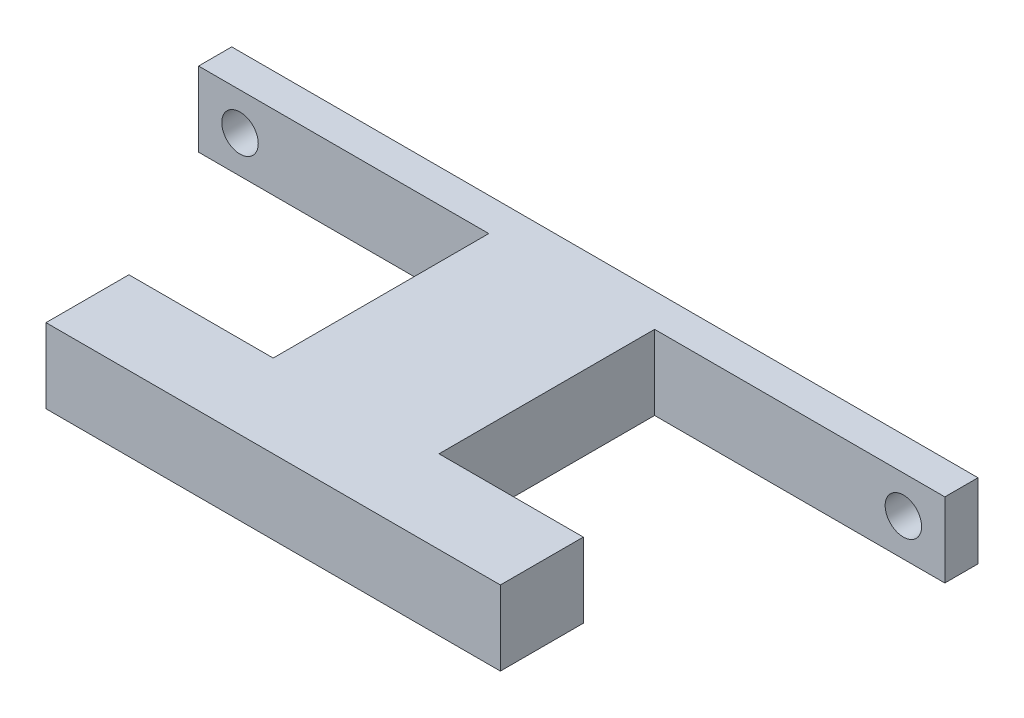
ISO-10303-21;
HEADER;
FILE_DESCRIPTION(('STEP AP214'),'2;1');
FILE_NAME('part.step','',(''),(''),'','','');
FILE_SCHEMA(('AUTOMOTIVE_DESIGN { 1 0 10303 214 1 1 1 1 }'));
ENDSEC;
DATA;
#1=APPLICATION_CONTEXT('core data for automotive mechanical design processes');
#2=APPLICATION_PROTOCOL_DEFINITION('international standard','automotive_design',2000,#1);
#3=PRODUCT_CONTEXT('',#1,'mechanical');
#4=PRODUCT('Part','Part','',(#3));
#5=PRODUCT_RELATED_PRODUCT_CATEGORY('part','',(#4));
#6=PRODUCT_DEFINITION_FORMATION('','',#4);
#7=PRODUCT_DEFINITION_CONTEXT('part definition',#1,'design');
#8=PRODUCT_DEFINITION('design','',#6,#7);
#9=PRODUCT_DEFINITION_SHAPE('','',#8);
#10=(LENGTH_UNIT() NAMED_UNIT(*) SI_UNIT(.MILLI.,.METRE.));
#11=(NAMED_UNIT(*) PLANE_ANGLE_UNIT() SI_UNIT($,.RADIAN.));
#12=(NAMED_UNIT(*) SI_UNIT($,.STERADIAN.) SOLID_ANGLE_UNIT());
#13=UNCERTAINTY_MEASURE_WITH_UNIT(LENGTH_MEASURE(1.E-05),#10,'distance_accuracy_value','');
#14=(GEOMETRIC_REPRESENTATION_CONTEXT(3) GLOBAL_UNCERTAINTY_ASSIGNED_CONTEXT((#13)) GLOBAL_UNIT_ASSIGNED_CONTEXT((#10,
#11,#12)) REPRESENTATION_CONTEXT('',''));
#15=CARTESIAN_POINT('',(0.,0.,0.));
#16=DIRECTION('',(0.,0.,1.));
#17=DIRECTION('',(1.,0.,0.));
#18=AXIS2_PLACEMENT_3D('',#15,#16,#17);
#19=CARTESIAN_POINT('',(-12.7,-5.71499999999998,50.8));
#20=DIRECTION('',(1.,0.,0.));
#21=DIRECTION('',(0.,0.,-1.));
#22=AXIS2_PLACEMENT_3D('',#19,#20,#21);
#23=PLANE('',#22);
#24=DIRECTION('',(0.,-1.,0.));
#25=VECTOR('',#24,1.);
#26=CARTESIAN_POINT('',(-12.7,0.,38.1));
#27=LINE('',#26,#25);
#28=CARTESIAN_POINT('',(-12.7,5.71499999999998,38.1));
#29=VERTEX_POINT('',#28);
#30=CARTESIAN_POINT('',(-12.7,-5.71499999999998,38.1));
#31=VERTEX_POINT('',#30);
#32=EDGE_CURVE('E134',#29,#31,#27,.T.);
#33=ORIENTED_EDGE('',*,*,#32,.F.);
#34=DIRECTION('',(0.,0.,-1.));
#35=VECTOR('',#34,1.);
#36=CARTESIAN_POINT('',(-12.7,5.71499999999998,50.8));
#37=LINE('',#36,#35);
#38=CARTESIAN_POINT('',(-12.7,5.71499999999998,5.08));
#39=VERTEX_POINT('',#38);
#40=EDGE_CURVE('E143',#29,#39,#37,.T.);
#41=ORIENTED_EDGE('',*,*,#40,.T.);
#42=DIRECTION('',(0.,-1.,0.));
#43=VECTOR('',#42,1.);
#44=CARTESIAN_POINT('',(-12.7,-5.71499999999998,5.08));
#45=LINE('',#44,#43);
#46=CARTESIAN_POINT('',(-12.7,-5.71499999999998,5.08));
#47=VERTEX_POINT('',#46);
#48=EDGE_CURVE('E218',#39,#47,#45,.T.);
#49=ORIENTED_EDGE('',*,*,#48,.T.);
#50=DIRECTION('',(0.,0.,-1.));
#51=VECTOR('',#50,1.);
#52=CARTESIAN_POINT('',(-12.7,-5.71499999999998,50.8));
#53=LINE('',#52,#51);
#54=EDGE_CURVE('E145',#31,#47,#53,.T.);
#55=ORIENTED_EDGE('',*,*,#54,.F.);
#56=EDGE_LOOP('',(#33,#41,#49,#55));
#57=FACE_BOUND('',#56,.T.);
#58=ADVANCED_FACE('F39',(#57),#23,.F.);
#59=CARTESIAN_POINT('',(12.7,-5.71499999999998,50.8));
#60=DIRECTION('',(-1.,0.,0.));
#61=DIRECTION('',(0.,0.,1.));
#62=AXIS2_PLACEMENT_3D('',#59,#60,#61);
#63=PLANE('',#62);
#64=DIRECTION('',(0.,1.,0.));
#65=VECTOR('',#64,1.);
#66=CARTESIAN_POINT('',(12.7,0.,38.1));
#67=LINE('',#66,#65);
#68=CARTESIAN_POINT('',(12.7,-5.71499999999998,38.1));
#69=VERTEX_POINT('',#68);
#70=CARTESIAN_POINT('',(12.7,5.71499999999998,38.1));
#71=VERTEX_POINT('',#70);
#72=EDGE_CURVE('E243',#69,#71,#67,.T.);
#73=ORIENTED_EDGE('',*,*,#72,.F.);
#74=DIRECTION('',(0.,0.,-1.));
#75=VECTOR('',#74,1.);
#76=CARTESIAN_POINT('',(12.7,-5.71499999999998,50.8));
#77=LINE('',#76,#75);
#78=CARTESIAN_POINT('',(12.7,-5.71499999999998,5.08));
#79=VERTEX_POINT('',#78);
#80=EDGE_CURVE('E54',#69,#79,#77,.T.);
#81=ORIENTED_EDGE('',*,*,#80,.T.);
#82=DIRECTION('',(0.,1.,0.));
#83=VECTOR('',#82,1.);
#84=CARTESIAN_POINT('',(12.7,-5.71499999999998,5.08));
#85=LINE('',#84,#83);
#86=CARTESIAN_POINT('',(12.7,5.71499999999998,5.08));
#87=VERTEX_POINT('',#86);
#88=EDGE_CURVE('E217',#79,#87,#85,.T.);
#89=ORIENTED_EDGE('',*,*,#88,.T.);
#90=DIRECTION('',(0.,0.,-1.));
#91=VECTOR('',#90,1.);
#92=CARTESIAN_POINT('',(12.7,5.71499999999998,50.8));
#93=LINE('',#92,#91);
#94=EDGE_CURVE('E62',#71,#87,#93,.T.);
#95=ORIENTED_EDGE('',*,*,#94,.F.);
#96=EDGE_LOOP('',(#73,#81,#89,#95));
#97=FACE_BOUND('',#96,.T.);
#98=ADVANCED_FACE('F277',(#97),#63,.F.);
#99=CARTESIAN_POINT('',(0.,0.,5.08));
#100=DIRECTION('',(0.,0.,1.));
#101=DIRECTION('',(1.,0.,0.));
#102=AXIS2_PLACEMENT_3D('',#99,#100,#101);
#103=PLANE('',#102);
#104=ORIENTED_EDGE('',*,*,#88,.F.);
#105=DIRECTION('',(-1.,0.,0.));
#106=VECTOR('',#105,1.);
#107=CARTESIAN_POINT('',(0.,-5.71499999999998,5.08));
#108=LINE('',#107,#106);
#109=CARTESIAN_POINT('',(57.15,-5.71499999999998,5.08));
#110=VERTEX_POINT('',#109);
#111=EDGE_CURVE('E164',#110,#79,#108,.T.);
#112=ORIENTED_EDGE('',*,*,#111,.F.);
#113=DIRECTION('',(0.,-1.,0.));
#114=VECTOR('',#113,1.);
#115=CARTESIAN_POINT('',(57.15,0.,5.08));
#116=LINE('',#115,#114);
#117=CARTESIAN_POINT('',(57.15,5.71499999999998,5.08));
#118=VERTEX_POINT('',#117);
#119=EDGE_CURVE('E167',#118,#110,#116,.T.);
#120=ORIENTED_EDGE('',*,*,#119,.F.);
#121=DIRECTION('',(1.,0.,0.));
#122=VECTOR('',#121,1.);
#123=CARTESIAN_POINT('',(0.,5.71499999999998,5.08));
#124=LINE('',#123,#122);
#125=EDGE_CURVE('E160',#87,#118,#124,.T.);
#126=ORIENTED_EDGE('',*,*,#125,.F.);
#127=EDGE_LOOP('',(#104,#112,#120,#126));
#128=FACE_BOUND('',#127,.T.);
#129=CARTESIAN_POINT('',(50.8,0.,5.08));
#130=DIRECTION('',(0.,0.,1.));
#131=DIRECTION('',(1.,0.,0.));
#132=AXIS2_PLACEMENT_3D('',#129,#130,#131);
#133=CIRCLE('',#132,2.794);
#134=CARTESIAN_POINT('',(53.594,0.,5.08));
#135=VERTEX_POINT('',#134);
#136=EDGE_CURVE('E173',#135,#135,#133,.T.);
#137=ORIENTED_EDGE('',*,*,#136,.F.);
#138=EDGE_LOOP('',(#137));
#139=FACE_BOUND('',#138,.T.);
#140=ADVANCED_FACE('F215',(#128,#139),#103,.T.);
#141=CARTESIAN_POINT('',(0.,5.71499999999998,5.08));
#142=DIRECTION('',(0.,1.,0.));
#143=DIRECTION('',(0.,0.,1.));
#144=AXIS2_PLACEMENT_3D('',#141,#142,#143);
#145=PLANE('',#144);
#146=DIRECTION('',(1.,0.,0.));
#147=VECTOR('',#146,1.);
#148=CARTESIAN_POINT('',(0.,5.71499999999998,0.));
#149=LINE('',#148,#147);
#150=CARTESIAN_POINT('',(-57.15,5.71499999999998,0.));
#151=VERTEX_POINT('',#150);
#152=CARTESIAN_POINT('',(57.15,5.71499999999998,0.));
#153=VERTEX_POINT('',#152);
#154=EDGE_CURVE('E153',#151,#153,#149,.T.);
#155=ORIENTED_EDGE('',*,*,#154,.F.);
#156=DIRECTION('',(0.,0.,-1.));
#157=VECTOR('',#156,1.);
#158=CARTESIAN_POINT('',(-57.15,5.71499999999998,5.08));
#159=LINE('',#158,#157);
#160=CARTESIAN_POINT('',(-57.15,5.71499999999998,5.08));
#161=VERTEX_POINT('',#160);
#162=EDGE_CURVE('E11',#161,#151,#159,.T.);
#163=ORIENTED_EDGE('',*,*,#162,.F.);
#164=EDGE_CURVE('E151',#161,#39,#124,.T.);
#165=ORIENTED_EDGE('',*,*,#164,.T.);
#166=ORIENTED_EDGE('',*,*,#40,.F.);
#167=DIRECTION('',(-1.,0.,0.));
#168=VECTOR('',#167,1.);
#169=CARTESIAN_POINT('',(0.,5.71499999999998,38.1));
#170=LINE('',#169,#168);
#171=CARTESIAN_POINT('',(-34.7966871988916,5.71499999999998,38.1));
#172=VERTEX_POINT('',#171);
#173=EDGE_CURVE('E131',#29,#172,#170,.T.);
#174=ORIENTED_EDGE('',*,*,#173,.T.);
#175=DIRECTION('',(0.,0.,1.));
#176=VECTOR('',#175,1.);
#177=CARTESIAN_POINT('',(-34.7966871988916,5.71499999999998,38.1));
#178=LINE('',#177,#176);
#179=CARTESIAN_POINT('',(-34.7966871988916,5.71499999999998,50.8));
#180=VERTEX_POINT('',#179);
#181=EDGE_CURVE('E248',#172,#180,#178,.T.);
#182=ORIENTED_EDGE('',*,*,#181,.T.);
#183=DIRECTION('',(-1.,0.,0.));
#184=VECTOR('',#183,1.);
#185=CARTESIAN_POINT('',(-12.7,5.71499999999998,50.8));
#186=LINE('',#185,#184);
#187=CARTESIAN_POINT('',(34.7966871988916,5.71499999999998,50.8));
#188=VERTEX_POINT('',#187);
#189=EDGE_CURVE('E221',#188,#180,#186,.T.);
#190=ORIENTED_EDGE('',*,*,#189,.F.);
#191=DIRECTION('',(0.,0.,1.));
#192=VECTOR('',#191,1.);
#193=CARTESIAN_POINT('',(34.7966871988916,5.71499999999998,38.1));
#194=LINE('',#193,#192);
#195=CARTESIAN_POINT('',(34.7966871988916,5.71499999999998,38.1));
#196=VERTEX_POINT('',#195);
#197=EDGE_CURVE('E224',#196,#188,#194,.T.);
#198=ORIENTED_EDGE('',*,*,#197,.F.);
#199=DIRECTION('',(1.,0.,0.));
#200=VECTOR('',#199,1.);
#201=CARTESIAN_POINT('',(0.,5.71499999999998,38.1));
#202=LINE('',#201,#200);
#203=EDGE_CURVE('E245',#71,#196,#202,.T.);
#204=ORIENTED_EDGE('',*,*,#203,.F.);
#205=ORIENTED_EDGE('',*,*,#94,.T.);
#206=ORIENTED_EDGE('',*,*,#125,.T.);
#207=DIRECTION('',(0.,0.,-1.));
#208=VECTOR('',#207,1.);
#209=CARTESIAN_POINT('',(57.15,5.71499999999998,5.08));
#210=LINE('',#209,#208);
#211=EDGE_CURVE('E176',#118,#153,#210,.T.);
#212=ORIENTED_EDGE('',*,*,#211,.T.);
#213=EDGE_LOOP('',(#155,#163,#165,#166,#174,#182,#190,#198,#204,#205,#206,#212));
#214=FACE_BOUND('',#213,.T.);
#215=ADVANCED_FACE('F41',(#214),#145,.T.);
#216=CARTESIAN_POINT('',(-57.15,0.,5.08));
#217=DIRECTION('',(-1.,0.,0.));
#218=DIRECTION('',(0.,0.,1.));
#219=AXIS2_PLACEMENT_3D('',#216,#217,#218);
#220=PLANE('',#219);
#221=DIRECTION('',(0.,1.,0.));
#222=VECTOR('',#221,1.);
#223=CARTESIAN_POINT('',(-57.15,0.,0.));
#224=LINE('',#223,#222);
#225=CARTESIAN_POINT('',(-57.15,-5.71499999999998,0.));
#226=VERTEX_POINT('',#225);
#227=EDGE_CURVE('E179',#226,#151,#224,.T.);
#228=ORIENTED_EDGE('',*,*,#227,.F.);
#229=DIRECTION('',(0.,0.,-1.));
#230=VECTOR('',#229,1.);
#231=CARTESIAN_POINT('',(-57.15,-5.71499999999998,5.08));
#232=LINE('',#231,#230);
#233=CARTESIAN_POINT('',(-57.15,-5.71499999999998,5.08));
#234=VERTEX_POINT('',#233);
#235=EDGE_CURVE('E47',#234,#226,#232,.T.);
#236=ORIENTED_EDGE('',*,*,#235,.F.);
#237=DIRECTION('',(0.,1.,0.));
#238=VECTOR('',#237,1.);
#239=CARTESIAN_POINT('',(-57.15,0.,5.08));
#240=LINE('',#239,#238);
#241=EDGE_CURVE('E159',#234,#161,#240,.T.);
#242=ORIENTED_EDGE('',*,*,#241,.T.);
#243=ORIENTED_EDGE('',*,*,#162,.T.);
#244=EDGE_LOOP('',(#228,#236,#242,#243));
#245=FACE_BOUND('',#244,.T.);
#246=ADVANCED_FACE('F204',(#245),#220,.T.);
#247=CARTESIAN_POINT('',(0.,-5.71499999999998,5.08));
#248=DIRECTION('',(0.,-1.,0.));
#249=DIRECTION('',(0.,0.,-1.));
#250=AXIS2_PLACEMENT_3D('',#247,#248,#249);
#251=PLANE('',#250);
#252=DIRECTION('',(-1.,0.,0.));
#253=VECTOR('',#252,1.);
#254=CARTESIAN_POINT('',(0.,-5.71499999999998,0.));
#255=LINE('',#254,#253);
#256=CARTESIAN_POINT('',(57.15,-5.71499999999998,0.));
#257=VERTEX_POINT('',#256);
#258=EDGE_CURVE('E182',#257,#226,#255,.T.);
#259=ORIENTED_EDGE('',*,*,#258,.F.);
#260=DIRECTION('',(0.,0.,-1.));
#261=VECTOR('',#260,1.);
#262=CARTESIAN_POINT('',(57.15,-5.71499999999998,5.08));
#263=LINE('',#262,#261);
#264=EDGE_CURVE('E195',#110,#257,#263,.T.);
#265=ORIENTED_EDGE('',*,*,#264,.F.);
#266=ORIENTED_EDGE('',*,*,#111,.T.);
#267=ORIENTED_EDGE('',*,*,#80,.F.);
#268=DIRECTION('',(1.,0.,0.));
#269=VECTOR('',#268,1.);
#270=CARTESIAN_POINT('',(0.,-5.71499999999998,38.1));
#271=LINE('',#270,#269);
#272=CARTESIAN_POINT('',(34.7966871988916,-5.71499999999998,38.1));
#273=VERTEX_POINT('',#272);
#274=EDGE_CURVE('E234',#69,#273,#271,.T.);
#275=ORIENTED_EDGE('',*,*,#274,.T.);
#276=DIRECTION('',(0.,0.,1.));
#277=VECTOR('',#276,1.);
#278=CARTESIAN_POINT('',(34.7966871988916,-5.71499999999998,38.1));
#279=LINE('',#278,#277);
#280=CARTESIAN_POINT('',(34.7966871988916,-5.71499999999998,50.8));
#281=VERTEX_POINT('',#280);
#282=EDGE_CURVE('E219',#273,#281,#279,.T.);
#283=ORIENTED_EDGE('',*,*,#282,.T.);
#284=DIRECTION('',(1.,0.,0.));
#285=VECTOR('',#284,1.);
#286=CARTESIAN_POINT('',(-12.7,-5.71499999999998,50.8));
#287=LINE('',#286,#285);
#288=CARTESIAN_POINT('',(-34.7966871988916,-5.71499999999998,50.8));
#289=VERTEX_POINT('',#288);
#290=EDGE_CURVE('E227',#289,#281,#287,.T.);
#291=ORIENTED_EDGE('',*,*,#290,.F.);
#292=DIRECTION('',(0.,0.,1.));
#293=VECTOR('',#292,1.);
#294=CARTESIAN_POINT('',(-34.7966871988916,-5.71499999999998,38.1));
#295=LINE('',#294,#293);
#296=CARTESIAN_POINT('',(-34.7966871988916,-5.71499999999998,38.1));
#297=VERTEX_POINT('',#296);
#298=EDGE_CURVE('E240',#297,#289,#295,.T.);
#299=ORIENTED_EDGE('',*,*,#298,.F.);
#300=DIRECTION('',(-1.,0.,0.));
#301=VECTOR('',#300,1.);
#302=CARTESIAN_POINT('',(0.,-5.71499999999998,38.1));
#303=LINE('',#302,#301);
#304=EDGE_CURVE('E250',#31,#297,#303,.T.);
#305=ORIENTED_EDGE('',*,*,#304,.F.);
#306=ORIENTED_EDGE('',*,*,#54,.T.);
#307=EDGE_CURVE('E163',#47,#234,#108,.T.);
#308=ORIENTED_EDGE('',*,*,#307,.T.);
#309=ORIENTED_EDGE('',*,*,#235,.T.);
#310=EDGE_LOOP('',(#259,#265,#266,#267,#275,#283,#291,#299,#305,#306,#308,#309));
#311=FACE_BOUND('',#310,.T.);
#312=ADVANCED_FACE('F200',(#311),#251,.T.);
#313=CARTESIAN_POINT('',(-50.8,0.,5.08));
#314=DIRECTION('',(0.,0.,-1.));
#315=DIRECTION('',(-1.,0.,0.));
#316=AXIS2_PLACEMENT_3D('',#313,#314,#315);
#317=CYLINDRICAL_SURFACE('',#316,2.794);
#318=CARTESIAN_POINT('',(-50.8,0.,5.08));
#319=DIRECTION('',(0.,0.,1.));
#320=DIRECTION('',(1.,0.,0.));
#321=AXIS2_PLACEMENT_3D('',#318,#319,#320);
#322=CIRCLE('',#321,2.794);
#323=CARTESIAN_POINT('',(-48.006,0.,5.08));
#324=VERTEX_POINT('',#323);
#325=EDGE_CURVE('E170',#324,#324,#322,.T.);
#326=ORIENTED_EDGE('',*,*,#325,.T.);
#327=EDGE_LOOP('',(#326));
#328=FACE_BOUND('',#327,.T.);
#329=CARTESIAN_POINT('',(-50.8,0.,0.));
#330=DIRECTION('',(0.,0.,1.));
#331=DIRECTION('',(1.,0.,0.));
#332=AXIS2_PLACEMENT_3D('',#329,#330,#331);
#333=CIRCLE('',#332,2.794);
#334=CARTESIAN_POINT('',(-48.006,0.,0.));
#335=VERTEX_POINT('',#334);
#336=EDGE_CURVE('E188',#335,#335,#333,.T.);
#337=ORIENTED_EDGE('',*,*,#336,.F.);
#338=EDGE_LOOP('',(#337));
#339=FACE_BOUND('',#338,.T.);
#340=ADVANCED_FACE('F290',(#328,#339),#317,.F.);
#341=CARTESIAN_POINT('',(57.15,0.,5.08));
#342=DIRECTION('',(1.,0.,0.));
#343=DIRECTION('',(0.,0.,-1.));
#344=AXIS2_PLACEMENT_3D('',#341,#342,#343);
#345=PLANE('',#344);
#346=DIRECTION('',(0.,-1.,0.));
#347=VECTOR('',#346,1.);
#348=CARTESIAN_POINT('',(57.15,0.,0.));
#349=LINE('',#348,#347);
#350=EDGE_CURVE('E185',#153,#257,#349,.T.);
#351=ORIENTED_EDGE('',*,*,#350,.F.);
#352=ORIENTED_EDGE('',*,*,#211,.F.);
#353=ORIENTED_EDGE('',*,*,#119,.T.);
#354=ORIENTED_EDGE('',*,*,#264,.T.);
#355=EDGE_LOOP('',(#351,#352,#353,#354));
#356=FACE_BOUND('',#355,.T.);
#357=ADVANCED_FACE('F211',(#356),#345,.T.);
#358=CARTESIAN_POINT('',(50.8,0.,5.08));
#359=DIRECTION('',(0.,0.,-1.));
#360=DIRECTION('',(-1.,0.,0.));
#361=AXIS2_PLACEMENT_3D('',#358,#359,#360);
#362=CYLINDRICAL_SURFACE('',#361,2.794);
#363=ORIENTED_EDGE('',*,*,#136,.T.);
#364=EDGE_LOOP('',(#363));
#365=FACE_BOUND('',#364,.T.);
#366=CARTESIAN_POINT('',(50.8,0.,0.));
#367=DIRECTION('',(0.,0.,1.));
#368=DIRECTION('',(1.,0.,0.));
#369=AXIS2_PLACEMENT_3D('',#366,#367,#368);
#370=CIRCLE('',#369,2.794);
#371=CARTESIAN_POINT('',(53.594,0.,0.));
#372=VERTEX_POINT('',#371);
#373=EDGE_CURVE('E191',#372,#372,#370,.T.);
#374=ORIENTED_EDGE('',*,*,#373,.F.);
#375=EDGE_LOOP('',(#374));
#376=FACE_BOUND('',#375,.T.);
#377=ADVANCED_FACE('F284',(#365,#376),#362,.F.);
#378=ORIENTED_EDGE('',*,*,#48,.F.);
#379=ORIENTED_EDGE('',*,*,#164,.F.);
#380=ORIENTED_EDGE('',*,*,#241,.F.);
#381=ORIENTED_EDGE('',*,*,#307,.F.);
#382=EDGE_LOOP('',(#378,#379,#380,#381));
#383=FACE_BOUND('',#382,.T.);
#384=ORIENTED_EDGE('',*,*,#325,.F.);
#385=EDGE_LOOP('',(#384));
#386=FACE_BOUND('',#385,.T.);
#387=ADVANCED_FACE('F273',(#383,#386),#103,.T.);
#388=CARTESIAN_POINT('',(0.,0.,0.));
#389=DIRECTION('',(0.,0.,1.));
#390=DIRECTION('',(1.,0.,0.));
#391=AXIS2_PLACEMENT_3D('',#388,#389,#390);
#392=PLANE('',#391);
#393=ORIENTED_EDGE('',*,*,#154,.T.);
#394=ORIENTED_EDGE('',*,*,#350,.T.);
#395=ORIENTED_EDGE('',*,*,#258,.T.);
#396=ORIENTED_EDGE('',*,*,#227,.T.);
#397=EDGE_LOOP('',(#393,#394,#395,#396));
#398=FACE_BOUND('',#397,.T.);
#399=ORIENTED_EDGE('',*,*,#336,.T.);
#400=EDGE_LOOP('',(#399));
#401=FACE_BOUND('',#400,.T.);
#402=ORIENTED_EDGE('',*,*,#373,.T.);
#403=EDGE_LOOP('',(#402));
#404=FACE_BOUND('',#403,.T.);
#405=ADVANCED_FACE('F206',(#398,#401,#404),#392,.F.);
#406=CARTESIAN_POINT('',(0.,0.,50.8));
#407=DIRECTION('',(0.,0.,-1.));
#408=DIRECTION('',(-1.,0.,0.));
#409=AXIS2_PLACEMENT_3D('',#406,#407,#408);
#410=PLANE('',#409);
#411=ORIENTED_EDGE('',*,*,#290,.T.);
#412=DIRECTION('',(0.,-1.,0.));
#413=VECTOR('',#412,1.);
#414=CARTESIAN_POINT('',(34.7966871988916,0.,50.8));
#415=LINE('',#414,#413);
#416=EDGE_CURVE('E236',#188,#281,#415,.T.);
#417=ORIENTED_EDGE('',*,*,#416,.F.);
#418=ORIENTED_EDGE('',*,*,#189,.T.);
#419=DIRECTION('',(0.,-1.,0.));
#420=VECTOR('',#419,1.);
#421=CARTESIAN_POINT('',(-34.7966871988916,0.,50.8));
#422=LINE('',#421,#420);
#423=EDGE_CURVE('E146',#180,#289,#422,.T.);
#424=ORIENTED_EDGE('',*,*,#423,.T.);
#425=EDGE_LOOP('',(#411,#417,#418,#424));
#426=FACE_BOUND('',#425,.T.);
#427=ADVANCED_FACE('F264',(#426),#410,.F.);
#428=CARTESIAN_POINT('',(34.7966871988916,0.,38.1));
#429=DIRECTION('',(-1.,0.,0.));
#430=DIRECTION('',(0.,0.,1.));
#431=AXIS2_PLACEMENT_3D('',#428,#429,#430);
#432=PLANE('',#431);
#433=ORIENTED_EDGE('',*,*,#416,.T.);
#434=ORIENTED_EDGE('',*,*,#282,.F.);
#435=DIRECTION('',(0.,-1.,0.));
#436=VECTOR('',#435,1.);
#437=CARTESIAN_POINT('',(34.7966871988916,0.,38.1));
#438=LINE('',#437,#436);
#439=EDGE_CURVE('E239',#196,#273,#438,.T.);
#440=ORIENTED_EDGE('',*,*,#439,.F.);
#441=ORIENTED_EDGE('',*,*,#197,.T.);
#442=EDGE_LOOP('',(#433,#434,#440,#441));
#443=FACE_BOUND('',#442,.T.);
#444=ADVANCED_FACE('F262',(#443),#432,.F.);
#445=CARTESIAN_POINT('',(0.,0.,38.1));
#446=DIRECTION('',(0.,0.,1.));
#447=DIRECTION('',(1.,0.,0.));
#448=AXIS2_PLACEMENT_3D('',#445,#446,#447);
#449=PLANE('',#448);
#450=ORIENTED_EDGE('',*,*,#439,.T.);
#451=ORIENTED_EDGE('',*,*,#274,.F.);
#452=ORIENTED_EDGE('',*,*,#72,.T.);
#453=ORIENTED_EDGE('',*,*,#203,.T.);
#454=EDGE_LOOP('',(#450,#451,#452,#453));
#455=FACE_BOUND('',#454,.T.);
#456=ADVANCED_FACE('F271',(#455),#449,.F.);
#457=CARTESIAN_POINT('',(-34.7966871988916,0.,38.1));
#458=DIRECTION('',(-1.,0.,0.));
#459=DIRECTION('',(0.,0.,1.));
#460=AXIS2_PLACEMENT_3D('',#457,#458,#459);
#461=PLANE('',#460);
#462=ORIENTED_EDGE('',*,*,#423,.F.);
#463=ORIENTED_EDGE('',*,*,#181,.F.);
#464=DIRECTION('',(0.,-1.,0.));
#465=VECTOR('',#464,1.);
#466=CARTESIAN_POINT('',(-34.7966871988916,0.,38.1));
#467=LINE('',#466,#465);
#468=EDGE_CURVE('E137',#172,#297,#467,.T.);
#469=ORIENTED_EDGE('',*,*,#468,.T.);
#470=ORIENTED_EDGE('',*,*,#298,.T.);
#471=EDGE_LOOP('',(#462,#463,#469,#470));
#472=FACE_BOUND('',#471,.T.);
#473=ADVANCED_FACE('F257',(#472),#461,.T.);
#474=CARTESIAN_POINT('',(0.,0.,38.1));
#475=DIRECTION('',(0.,0.,1.));
#476=DIRECTION('',(1.,0.,0.));
#477=AXIS2_PLACEMENT_3D('',#474,#475,#476);
#478=PLANE('',#477);
#479=ORIENTED_EDGE('',*,*,#32,.T.);
#480=ORIENTED_EDGE('',*,*,#304,.T.);
#481=ORIENTED_EDGE('',*,*,#468,.F.);
#482=ORIENTED_EDGE('',*,*,#173,.F.);
#483=EDGE_LOOP('',(#479,#480,#481,#482));
#484=FACE_BOUND('',#483,.T.);
#485=ADVANCED_FACE('F133',(#484),#478,.F.);
#486=CLOSED_SHELL('',(#58,#98,#140,#215,#246,#312,#340,#357,#377,#387,#405,#427,#444,#456,#473,#485));
#487=MANIFOLD_SOLID_BREP('B2',#486);
#488=ADVANCED_BREP_SHAPE_REPRESENTATION('',(#18,#487),#14);
#489=SHAPE_DEFINITION_REPRESENTATION(#9,#488);
ENDSEC;
END-ISO-10303-21;
